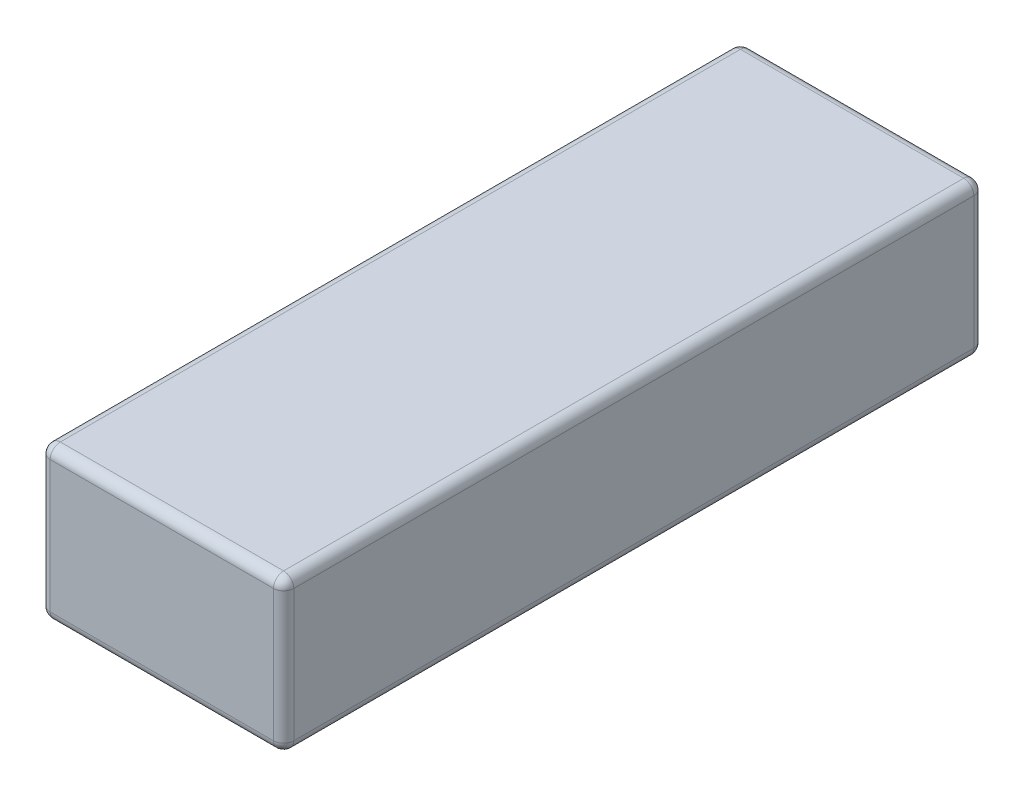
ISO-10303-21;
HEADER;
FILE_DESCRIPTION(('STEP AP214'),'2;1');
FILE_NAME('part.step','',(''),(''),'','','');
FILE_SCHEMA(('AUTOMOTIVE_DESIGN { 1 0 10303 214 1 1 1 1 }'));
ENDSEC;
DATA;
#1=APPLICATION_CONTEXT('core data for automotive mechanical design processes');
#2=APPLICATION_PROTOCOL_DEFINITION('international standard','automotive_design',2000,#1);
#3=PRODUCT_CONTEXT('',#1,'mechanical');
#4=PRODUCT('Part','Part','',(#3));
#5=PRODUCT_RELATED_PRODUCT_CATEGORY('part','',(#4));
#6=PRODUCT_DEFINITION_FORMATION('','',#4);
#7=PRODUCT_DEFINITION_CONTEXT('part definition',#1,'design');
#8=PRODUCT_DEFINITION('design','',#6,#7);
#9=PRODUCT_DEFINITION_SHAPE('','',#8);
#10=(LENGTH_UNIT() NAMED_UNIT(*) SI_UNIT(.MILLI.,.METRE.));
#11=(NAMED_UNIT(*) PLANE_ANGLE_UNIT() SI_UNIT($,.RADIAN.));
#12=(NAMED_UNIT(*) SI_UNIT($,.STERADIAN.) SOLID_ANGLE_UNIT());
#13=UNCERTAINTY_MEASURE_WITH_UNIT(LENGTH_MEASURE(1.E-05),#10,'distance_accuracy_value','');
#14=(GEOMETRIC_REPRESENTATION_CONTEXT(3) GLOBAL_UNCERTAINTY_ASSIGNED_CONTEXT((#13)) GLOBAL_UNIT_ASSIGNED_CONTEXT((#10,
#11,#12)) REPRESENTATION_CONTEXT('',''));
#15=CARTESIAN_POINT('',(0.,0.,0.));
#16=DIRECTION('',(0.,0.,1.));
#17=DIRECTION('',(1.,0.,0.));
#18=AXIS2_PLACEMENT_3D('',#15,#16,#17);
#19=CARTESIAN_POINT('',(48.,30.,-138.));
#20=DIRECTION('',(0.,1.,0.));
#21=DIRECTION('',(-1.,0.,0.));
#22=AXIS2_PLACEMENT_3D('',#19,#20,#21);
#23=PLANE('',#22);
#24=DIRECTION('',(-1.,0.,0.));
#25=VECTOR('',#24,1.);
#26=CARTESIAN_POINT('',(0.,30.,-136.));
#27=LINE('',#26,#25);
#28=CARTESIAN_POINT('',(46.,30.,-136.));
#29=VERTEX_POINT('',#28);
#30=CARTESIAN_POINT('',(2.,30.,-136.));
#31=VERTEX_POINT('',#30);
#32=EDGE_CURVE('E154',#29,#31,#27,.T.);
#33=ORIENTED_EDGE('',*,*,#32,.T.);
#34=DIRECTION('',(0.,0.,1.));
#35=VECTOR('',#34,1.);
#36=CARTESIAN_POINT('',(2.,30.,-138.));
#37=LINE('',#36,#35);
#38=CARTESIAN_POINT('',(2.,30.,-2.));
#39=VERTEX_POINT('',#38);
#40=EDGE_CURVE('E127',#31,#39,#37,.T.);
#41=ORIENTED_EDGE('',*,*,#40,.T.);
#42=DIRECTION('',(-1.,0.,0.));
#43=VECTOR('',#42,1.);
#44=CARTESIAN_POINT('',(48.,30.,-2.));
#45=LINE('',#44,#43);
#46=CARTESIAN_POINT('',(46.,30.,-2.));
#47=VERTEX_POINT('',#46);
#48=EDGE_CURVE('E145',#39,#47,#45,.F.);
#49=ORIENTED_EDGE('',*,*,#48,.T.);
#50=DIRECTION('',(0.,0.,1.));
#51=VECTOR('',#50,1.);
#52=CARTESIAN_POINT('',(46.,30.,-138.));
#53=LINE('',#52,#51);
#54=EDGE_CURVE('E151',#47,#29,#53,.F.);
#55=ORIENTED_EDGE('',*,*,#54,.T.);
#56=EDGE_LOOP('',(#33,#41,#49,#55));
#57=FACE_BOUND('',#56,.T.);
#58=ADVANCED_FACE('F34',(#57),#23,.T.);
#59=CARTESIAN_POINT('',(48.,0.,-138.));
#60=DIRECTION('',(1.,0.,0.));
#61=DIRECTION('',(0.,1.,0.));
#62=AXIS2_PLACEMENT_3D('',#59,#60,#61);
#63=PLANE('',#62);
#64=DIRECTION('',(0.,1.,0.));
#65=VECTOR('',#64,1.);
#66=CARTESIAN_POINT('',(48.,30.,-136.));
#67=LINE('',#66,#65);
#68=CARTESIAN_POINT('',(48.,2.,-136.));
#69=VERTEX_POINT('',#68);
#70=CARTESIAN_POINT('',(48.,28.,-136.));
#71=VERTEX_POINT('',#70);
#72=EDGE_CURVE('E178',#69,#71,#67,.T.);
#73=ORIENTED_EDGE('',*,*,#72,.T.);
#74=DIRECTION('',(0.,0.,1.));
#75=VECTOR('',#74,1.);
#76=CARTESIAN_POINT('',(48.,28.,-138.));
#77=LINE('',#76,#75);
#78=CARTESIAN_POINT('',(48.,28.,-2.));
#79=VERTEX_POINT('',#78);
#80=EDGE_CURVE('E182',#71,#79,#77,.T.);
#81=ORIENTED_EDGE('',*,*,#80,.T.);
#82=DIRECTION('',(0.,1.,0.));
#83=VECTOR('',#82,1.);
#84=CARTESIAN_POINT('',(48.,0.,-2.));
#85=LINE('',#84,#83);
#86=CARTESIAN_POINT('',(48.,2.,-2.));
#87=VERTEX_POINT('',#86);
#88=EDGE_CURVE('E180',#79,#87,#85,.F.);
#89=ORIENTED_EDGE('',*,*,#88,.T.);
#90=DIRECTION('',(0.,0.,1.));
#91=VECTOR('',#90,1.);
#92=CARTESIAN_POINT('',(48.,2.,-138.));
#93=LINE('',#92,#91);
#94=EDGE_CURVE('E176',#87,#69,#93,.F.);
#95=ORIENTED_EDGE('',*,*,#94,.T.);
#96=EDGE_LOOP('',(#73,#81,#89,#95));
#97=FACE_BOUND('',#96,.T.);
#98=ADVANCED_FACE('F298',(#97),#63,.T.);
#99=CARTESIAN_POINT('',(0.,0.,-138.));
#100=DIRECTION('',(0.,-1.,0.));
#101=DIRECTION('',(0.,0.,-1.));
#102=AXIS2_PLACEMENT_3D('',#99,#100,#101);
#103=PLANE('',#102);
#104=DIRECTION('',(1.,0.,0.));
#105=VECTOR('',#104,1.);
#106=CARTESIAN_POINT('',(0.,0.,-2.));
#107=LINE('',#106,#105);
#108=CARTESIAN_POINT('',(46.,0.,-2.));
#109=VERTEX_POINT('',#108);
#110=CARTESIAN_POINT('',(2.,0.,-2.));
#111=VERTEX_POINT('',#110);
#112=EDGE_CURVE('E54',#109,#111,#107,.F.);
#113=ORIENTED_EDGE('',*,*,#112,.T.);
#114=DIRECTION('',(0.,0.,1.));
#115=VECTOR('',#114,1.);
#116=CARTESIAN_POINT('',(2.,0.,-138.));
#117=LINE('',#116,#115);
#118=CARTESIAN_POINT('',(2.,0.,-136.));
#119=VERTEX_POINT('',#118);
#120=EDGE_CURVE('E11',#111,#119,#117,.F.);
#121=ORIENTED_EDGE('',*,*,#120,.T.);
#122=DIRECTION('',(1.,0.,0.));
#123=VECTOR('',#122,1.);
#124=CARTESIAN_POINT('',(48.,0.,-136.));
#125=LINE('',#124,#123);
#126=CARTESIAN_POINT('',(46.,0.,-136.));
#127=VERTEX_POINT('',#126);
#128=EDGE_CURVE('E43',#119,#127,#125,.T.);
#129=ORIENTED_EDGE('',*,*,#128,.T.);
#130=DIRECTION('',(0.,0.,1.));
#131=VECTOR('',#130,1.);
#132=CARTESIAN_POINT('',(46.,0.,-138.));
#133=LINE('',#132,#131);
#134=EDGE_CURVE('E194',#127,#109,#133,.T.);
#135=ORIENTED_EDGE('',*,*,#134,.T.);
#136=EDGE_LOOP('',(#113,#121,#129,#135));
#137=FACE_BOUND('',#136,.T.);
#138=ADVANCED_FACE('F264',(#137),#103,.T.);
#139=CARTESIAN_POINT('',(0.,30.,-138.));
#140=DIRECTION('',(-1.,0.,0.));
#141=DIRECTION('',(0.,0.,1.));
#142=AXIS2_PLACEMENT_3D('',#139,#140,#141);
#143=PLANE('',#142);
#144=DIRECTION('',(0.,-1.,0.));
#145=VECTOR('',#144,1.);
#146=CARTESIAN_POINT('',(0.,30.,-2.));
#147=LINE('',#146,#145);
#148=CARTESIAN_POINT('',(0.,2.,-2.));
#149=VERTEX_POINT('',#148);
#150=CARTESIAN_POINT('',(0.,28.,-2.));
#151=VERTEX_POINT('',#150);
#152=EDGE_CURVE('E158',#149,#151,#147,.F.);
#153=ORIENTED_EDGE('',*,*,#152,.T.);
#154=DIRECTION('',(0.,0.,1.));
#155=VECTOR('',#154,1.);
#156=CARTESIAN_POINT('',(0.,28.,-138.));
#157=LINE('',#156,#155);
#158=CARTESIAN_POINT('',(0.,28.,-136.));
#159=VERTEX_POINT('',#158);
#160=EDGE_CURVE('E129',#151,#159,#157,.F.);
#161=ORIENTED_EDGE('',*,*,#160,.T.);
#162=DIRECTION('',(0.,-1.,0.));
#163=VECTOR('',#162,1.);
#164=CARTESIAN_POINT('',(0.,0.,-136.));
#165=LINE('',#164,#163);
#166=CARTESIAN_POINT('',(0.,2.,-136.));
#167=VERTEX_POINT('',#166);
#168=EDGE_CURVE('E164',#159,#167,#165,.T.);
#169=ORIENTED_EDGE('',*,*,#168,.T.);
#170=DIRECTION('',(0.,0.,1.));
#171=VECTOR('',#170,1.);
#172=CARTESIAN_POINT('',(0.,2.,-138.));
#173=LINE('',#172,#171);
#174=EDGE_CURVE('E156',#167,#149,#173,.T.);
#175=ORIENTED_EDGE('',*,*,#174,.T.);
#176=EDGE_LOOP('',(#153,#161,#169,#175));
#177=FACE_BOUND('',#176,.T.);
#178=ADVANCED_FACE('F319',(#177),#143,.T.);
#179=CARTESIAN_POINT('',(0.,0.,-138.));
#180=DIRECTION('',(0.,0.,1.));
#181=DIRECTION('',(1.,0.,0.));
#182=AXIS2_PLACEMENT_3D('',#179,#180,#181);
#183=PLANE('',#182);
#184=DIRECTION('',(0.,-1.,0.));
#185=VECTOR('',#184,1.);
#186=CARTESIAN_POINT('',(2.,30.,-138.));
#187=LINE('',#186,#185);
#188=CARTESIAN_POINT('',(2.,2.,-138.));
#189=VERTEX_POINT('',#188);
#190=CARTESIAN_POINT('',(2.,28.,-138.));
#191=VERTEX_POINT('',#190);
#192=EDGE_CURVE('E171',#189,#191,#187,.F.);
#193=ORIENTED_EDGE('',*,*,#192,.T.);
#194=DIRECTION('',(-1.,0.,0.));
#195=VECTOR('',#194,1.);
#196=CARTESIAN_POINT('',(48.,28.,-138.));
#197=LINE('',#196,#195);
#198=CARTESIAN_POINT('',(46.,28.,-138.));
#199=VERTEX_POINT('',#198);
#200=EDGE_CURVE('E173',#191,#199,#197,.F.);
#201=ORIENTED_EDGE('',*,*,#200,.T.);
#202=DIRECTION('',(0.,1.,0.));
#203=VECTOR('',#202,1.);
#204=CARTESIAN_POINT('',(46.,0.,-138.));
#205=LINE('',#204,#203);
#206=CARTESIAN_POINT('',(46.,2.,-138.));
#207=VERTEX_POINT('',#206);
#208=EDGE_CURVE('E169',#199,#207,#205,.F.);
#209=ORIENTED_EDGE('',*,*,#208,.T.);
#210=DIRECTION('',(1.,0.,0.));
#211=VECTOR('',#210,1.);
#212=CARTESIAN_POINT('',(0.,2.,-138.));
#213=LINE('',#212,#211);
#214=EDGE_CURVE('E167',#207,#189,#213,.F.);
#215=ORIENTED_EDGE('',*,*,#214,.T.);
#216=EDGE_LOOP('',(#193,#201,#209,#215));
#217=FACE_BOUND('',#216,.T.);
#218=ADVANCED_FACE('F284',(#217),#183,.F.);
#219=CARTESIAN_POINT('',(0.,0.,0.));
#220=DIRECTION('',(0.,0.,1.));
#221=DIRECTION('',(1.,0.,0.));
#222=AXIS2_PLACEMENT_3D('',#219,#220,#221);
#223=PLANE('',#222);
#224=DIRECTION('',(0.,1.,0.));
#225=VECTOR('',#224,1.);
#226=CARTESIAN_POINT('',(46.,0.,0.));
#227=LINE('',#226,#225);
#228=CARTESIAN_POINT('',(46.,2.,0.));
#229=VERTEX_POINT('',#228);
#230=CARTESIAN_POINT('',(46.,28.,0.));
#231=VERTEX_POINT('',#230);
#232=EDGE_CURVE('E189',#229,#231,#227,.T.);
#233=ORIENTED_EDGE('',*,*,#232,.T.);
#234=DIRECTION('',(-1.,0.,0.));
#235=VECTOR('',#234,1.);
#236=CARTESIAN_POINT('',(0.,28.,0.));
#237=LINE('',#236,#235);
#238=CARTESIAN_POINT('',(2.,28.,0.));
#239=VERTEX_POINT('',#238);
#240=EDGE_CURVE('E191',#231,#239,#237,.T.);
#241=ORIENTED_EDGE('',*,*,#240,.T.);
#242=DIRECTION('',(0.,-1.,0.));
#243=VECTOR('',#242,1.);
#244=CARTESIAN_POINT('',(2.,0.,0.));
#245=LINE('',#244,#243);
#246=CARTESIAN_POINT('',(2.,2.,0.));
#247=VERTEX_POINT('',#246);
#248=EDGE_CURVE('E187',#239,#247,#245,.T.);
#249=ORIENTED_EDGE('',*,*,#248,.T.);
#250=DIRECTION('',(1.,0.,0.));
#251=VECTOR('',#250,1.);
#252=CARTESIAN_POINT('',(0.,2.,0.));
#253=LINE('',#252,#251);
#254=EDGE_CURVE('E185',#247,#229,#253,.T.);
#255=ORIENTED_EDGE('',*,*,#254,.T.);
#256=EDGE_LOOP('',(#233,#241,#249,#255));
#257=FACE_BOUND('',#256,.T.);
#258=ADVANCED_FACE('F326',(#257),#223,.T.);
#259=CARTESIAN_POINT('',(46.,2.,-138.));
#260=DIRECTION('',(0.,0.,1.));
#261=DIRECTION('',(1.,0.,0.));
#262=AXIS2_PLACEMENT_3D('',#259,#260,#261);
#263=CYLINDRICAL_SURFACE('',#262,2.);
#264=CARTESIAN_POINT('',(46.,2.,-136.));
#265=DIRECTION('',(0.,0.,-1.));
#266=DIRECTION('',(-1.,0.,0.));
#267=AXIS2_PLACEMENT_3D('',#264,#265,#266);
#268=CIRCLE('',#267,2.);
#269=EDGE_CURVE('E38',#69,#127,#268,.T.);
#270=ORIENTED_EDGE('',*,*,#269,.F.);
#271=ORIENTED_EDGE('',*,*,#94,.F.);
#272=CARTESIAN_POINT('',(46.,2.,-2.));
#273=DIRECTION('',(0.,0.,1.));
#274=DIRECTION('',(1.,0.,0.));
#275=AXIS2_PLACEMENT_3D('',#272,#273,#274);
#276=CIRCLE('',#275,2.);
#277=EDGE_CURVE('E247',#109,#87,#276,.T.);
#278=ORIENTED_EDGE('',*,*,#277,.F.);
#279=ORIENTED_EDGE('',*,*,#134,.F.);
#280=EDGE_LOOP('',(#270,#271,#278,#279));
#281=FACE_BOUND('',#280,.T.);
#282=ADVANCED_FACE('F36',(#281),#263,.T.);
#283=CARTESIAN_POINT('',(46.,2.,-136.));
#284=DIRECTION('',(0.,0.,1.));
#285=DIRECTION('',(1.,0.,0.));
#286=AXIS2_PLACEMENT_3D('',#283,#284,#285);
#287=SPHERICAL_SURFACE('',#286,2.);
#288=CARTESIAN_POINT('',(46.,2.,-136.));
#289=DIRECTION('',(0.,-1.,0.));
#290=DIRECTION('',(1.,0.,0.));
#291=AXIS2_PLACEMENT_3D('',#288,#289,#290);
#292=CIRCLE('',#291,2.);
#293=EDGE_CURVE('E243',#69,#207,#292,.F.);
#294=ORIENTED_EDGE('',*,*,#293,.F.);
#295=ORIENTED_EDGE('',*,*,#269,.T.);
#296=CARTESIAN_POINT('',(46.,2.,-136.));
#297=DIRECTION('',(1.,0.,0.));
#298=DIRECTION('',(0.,0.,-1.));
#299=AXIS2_PLACEMENT_3D('',#296,#297,#298);
#300=CIRCLE('',#299,2.);
#301=EDGE_CURVE('E246',#207,#127,#300,.F.);
#302=ORIENTED_EDGE('',*,*,#301,.F.);
#303=EDGE_LOOP('',(#294,#295,#302));
#304=FACE_BOUND('',#303,.T.);
#305=ADVANCED_FACE('F259',(#304),#287,.T.);
#306=CARTESIAN_POINT('',(46.,2.,-2.));
#307=DIRECTION('',(0.,0.,1.));
#308=DIRECTION('',(1.,0.,0.));
#309=AXIS2_PLACEMENT_3D('',#306,#307,#308);
#310=SPHERICAL_SURFACE('',#309,2.);
#311=CARTESIAN_POINT('',(46.,2.,-2.));
#312=DIRECTION('',(1.,0.,0.));
#313=DIRECTION('',(0.,0.,-1.));
#314=AXIS2_PLACEMENT_3D('',#311,#312,#313);
#315=CIRCLE('',#314,2.);
#316=EDGE_CURVE('E237',#109,#229,#315,.F.);
#317=ORIENTED_EDGE('',*,*,#316,.F.);
#318=ORIENTED_EDGE('',*,*,#277,.T.);
#319=CARTESIAN_POINT('',(46.,2.,-2.));
#320=DIRECTION('',(0.,-1.,0.));
#321=DIRECTION('',(1.,0.,0.));
#322=AXIS2_PLACEMENT_3D('',#319,#320,#321);
#323=CIRCLE('',#322,2.);
#324=EDGE_CURVE('E240',#229,#87,#323,.F.);
#325=ORIENTED_EDGE('',*,*,#324,.F.);
#326=EDGE_LOOP('',(#317,#318,#325));
#327=FACE_BOUND('',#326,.T.);
#328=ADVANCED_FACE('F308',(#327),#310,.T.);
#329=CARTESIAN_POINT('',(0.,2.,-136.));
#330=DIRECTION('',(-1.,0.,0.));
#331=DIRECTION('',(0.,0.,1.));
#332=AXIS2_PLACEMENT_3D('',#329,#330,#331);
#333=CYLINDRICAL_SURFACE('',#332,2.);
#334=ORIENTED_EDGE('',*,*,#301,.T.);
#335=ORIENTED_EDGE('',*,*,#128,.F.);
#336=CARTESIAN_POINT('',(2.,2.,-136.));
#337=DIRECTION('',(-1.,0.,0.));
#338=DIRECTION('',(0.,0.,1.));
#339=AXIS2_PLACEMENT_3D('',#336,#337,#338);
#340=CIRCLE('',#339,2.);
#341=EDGE_CURVE('E231',#189,#119,#340,.T.);
#342=ORIENTED_EDGE('',*,*,#341,.F.);
#343=ORIENTED_EDGE('',*,*,#214,.F.);
#344=EDGE_LOOP('',(#334,#335,#342,#343));
#345=FACE_BOUND('',#344,.T.);
#346=ADVANCED_FACE('F268',(#345),#333,.T.);
#347=CARTESIAN_POINT('',(46.,0.,-136.));
#348=DIRECTION('',(0.,-1.,0.));
#349=DIRECTION('',(1.,0.,0.));
#350=AXIS2_PLACEMENT_3D('',#347,#348,#349);
#351=CYLINDRICAL_SURFACE('',#350,2.);
#352=ORIENTED_EDGE('',*,*,#293,.T.);
#353=ORIENTED_EDGE('',*,*,#208,.F.);
#354=CARTESIAN_POINT('',(46.,28.,-136.));
#355=DIRECTION('',(0.,1.,0.));
#356=DIRECTION('',(0.,0.,1.));
#357=AXIS2_PLACEMENT_3D('',#354,#355,#356);
#358=CIRCLE('',#357,2.);
#359=EDGE_CURVE('E228',#71,#199,#358,.T.);
#360=ORIENTED_EDGE('',*,*,#359,.F.);
#361=ORIENTED_EDGE('',*,*,#72,.F.);
#362=EDGE_LOOP('',(#352,#353,#360,#361));
#363=FACE_BOUND('',#362,.T.);
#364=ADVANCED_FACE('F295',(#363),#351,.T.);
#365=CARTESIAN_POINT('',(46.,28.,-138.));
#366=DIRECTION('',(0.,0.,1.));
#367=DIRECTION('',(1.,0.,0.));
#368=AXIS2_PLACEMENT_3D('',#365,#366,#367);
#369=CYLINDRICAL_SURFACE('',#368,2.);
#370=CARTESIAN_POINT('',(46.,28.,-2.));
#371=DIRECTION('',(0.,0.,1.));
#372=DIRECTION('',(1.,0.,0.));
#373=AXIS2_PLACEMENT_3D('',#370,#371,#372);
#374=CIRCLE('',#373,2.);
#375=EDGE_CURVE('E222',#79,#47,#374,.T.);
#376=ORIENTED_EDGE('',*,*,#375,.F.);
#377=ORIENTED_EDGE('',*,*,#80,.F.);
#378=CARTESIAN_POINT('',(46.,28.,-136.));
#379=DIRECTION('',(0.,0.,-1.));
#380=DIRECTION('',(-1.,0.,0.));
#381=AXIS2_PLACEMENT_3D('',#378,#379,#380);
#382=CIRCLE('',#381,2.);
#383=EDGE_CURVE('E225',#29,#71,#382,.T.);
#384=ORIENTED_EDGE('',*,*,#383,.F.);
#385=ORIENTED_EDGE('',*,*,#54,.F.);
#386=EDGE_LOOP('',(#376,#377,#384,#385));
#387=FACE_BOUND('',#386,.T.);
#388=ADVANCED_FACE('F301',(#387),#369,.T.);
#389=CARTESIAN_POINT('',(46.,0.,-2.));
#390=DIRECTION('',(0.,1.,0.));
#391=DIRECTION('',(-1.,0.,0.));
#392=AXIS2_PLACEMENT_3D('',#389,#390,#391);
#393=CYLINDRICAL_SURFACE('',#392,2.);
#394=ORIENTED_EDGE('',*,*,#324,.T.);
#395=ORIENTED_EDGE('',*,*,#88,.F.);
#396=CARTESIAN_POINT('',(46.,28.,-2.));
#397=DIRECTION('',(0.,1.,0.));
#398=DIRECTION('',(0.,0.,1.));
#399=AXIS2_PLACEMENT_3D('',#396,#397,#398);
#400=CIRCLE('',#399,2.);
#401=EDGE_CURVE('E220',#231,#79,#400,.T.);
#402=ORIENTED_EDGE('',*,*,#401,.F.);
#403=ORIENTED_EDGE('',*,*,#232,.F.);
#404=EDGE_LOOP('',(#394,#395,#402,#403));
#405=FACE_BOUND('',#404,.T.);
#406=ADVANCED_FACE('F306',(#405),#393,.T.);
#407=CARTESIAN_POINT('',(0.,2.,-2.));
#408=DIRECTION('',(1.,0.,0.));
#409=DIRECTION('',(0.,0.,-1.));
#410=AXIS2_PLACEMENT_3D('',#407,#408,#409);
#411=CYLINDRICAL_SURFACE('',#410,2.);
#412=ORIENTED_EDGE('',*,*,#316,.T.);
#413=ORIENTED_EDGE('',*,*,#254,.F.);
#414=CARTESIAN_POINT('',(2.,2.,-2.));
#415=DIRECTION('',(-1.,0.,0.));
#416=DIRECTION('',(0.,0.,1.));
#417=AXIS2_PLACEMENT_3D('',#414,#415,#416);
#418=CIRCLE('',#417,2.);
#419=EDGE_CURVE('E217',#111,#247,#418,.T.);
#420=ORIENTED_EDGE('',*,*,#419,.F.);
#421=ORIENTED_EDGE('',*,*,#112,.F.);
#422=EDGE_LOOP('',(#412,#413,#420,#421));
#423=FACE_BOUND('',#422,.T.);
#424=ADVANCED_FACE('F311',(#423),#411,.T.);
#425=CARTESIAN_POINT('',(2.,2.,-138.));
#426=DIRECTION('',(0.,0.,1.));
#427=DIRECTION('',(1.,0.,0.));
#428=AXIS2_PLACEMENT_3D('',#425,#426,#427);
#429=CYLINDRICAL_SURFACE('',#428,2.);
#430=CARTESIAN_POINT('',(2.,2.,-136.));
#431=DIRECTION('',(0.,0.,-1.));
#432=DIRECTION('',(-1.,0.,0.));
#433=AXIS2_PLACEMENT_3D('',#430,#431,#432);
#434=CIRCLE('',#433,2.);
#435=EDGE_CURVE('E234',#119,#167,#434,.T.);
#436=ORIENTED_EDGE('',*,*,#435,.F.);
#437=ORIENTED_EDGE('',*,*,#120,.F.);
#438=CARTESIAN_POINT('',(2.,2.,-2.));
#439=DIRECTION('',(0.,0.,1.));
#440=DIRECTION('',(1.,0.,0.));
#441=AXIS2_PLACEMENT_3D('',#438,#439,#440);
#442=CIRCLE('',#441,2.);
#443=EDGE_CURVE('E214',#149,#111,#442,.T.);
#444=ORIENTED_EDGE('',*,*,#443,.F.);
#445=ORIENTED_EDGE('',*,*,#174,.F.);
#446=EDGE_LOOP('',(#436,#437,#444,#445));
#447=FACE_BOUND('',#446,.T.);
#448=ADVANCED_FACE('F272',(#447),#429,.T.);
#449=CARTESIAN_POINT('',(2.,2.,-136.));
#450=DIRECTION('',(0.,0.,1.));
#451=DIRECTION('',(1.,0.,0.));
#452=AXIS2_PLACEMENT_3D('',#449,#450,#451);
#453=SPHERICAL_SURFACE('',#452,2.);
#454=ORIENTED_EDGE('',*,*,#341,.T.);
#455=ORIENTED_EDGE('',*,*,#435,.T.);
#456=CARTESIAN_POINT('',(2.,2.,-136.));
#457=DIRECTION('',(0.,-1.,0.));
#458=DIRECTION('',(0.,0.,-1.));
#459=AXIS2_PLACEMENT_3D('',#456,#457,#458);
#460=CIRCLE('',#459,2.);
#461=EDGE_CURVE('E211',#189,#167,#460,.F.);
#462=ORIENTED_EDGE('',*,*,#461,.F.);
#463=EDGE_LOOP('',(#454,#455,#462));
#464=FACE_BOUND('',#463,.T.);
#465=ADVANCED_FACE('F276',(#464),#453,.T.);
#466=CARTESIAN_POINT('',(46.,28.,-136.));
#467=DIRECTION('',(0.,0.,1.));
#468=DIRECTION('',(1.,0.,0.));
#469=AXIS2_PLACEMENT_3D('',#466,#467,#468);
#470=SPHERICAL_SURFACE('',#469,2.);
#471=ORIENTED_EDGE('',*,*,#383,.T.);
#472=ORIENTED_EDGE('',*,*,#359,.T.);
#473=CARTESIAN_POINT('',(46.,28.,-136.));
#474=DIRECTION('',(1.,0.,0.));
#475=DIRECTION('',(0.,0.,-1.));
#476=AXIS2_PLACEMENT_3D('',#473,#474,#475);
#477=CIRCLE('',#476,2.);
#478=EDGE_CURVE('E209',#29,#199,#477,.F.);
#479=ORIENTED_EDGE('',*,*,#478,.F.);
#480=EDGE_LOOP('',(#471,#472,#479));
#481=FACE_BOUND('',#480,.T.);
#482=ADVANCED_FACE('F292',(#481),#470,.T.);
#483=CARTESIAN_POINT('',(46.,28.,-2.));
#484=DIRECTION('',(0.,0.,1.));
#485=DIRECTION('',(1.,0.,0.));
#486=AXIS2_PLACEMENT_3D('',#483,#484,#485);
#487=SPHERICAL_SURFACE('',#486,2.);
#488=ORIENTED_EDGE('',*,*,#401,.T.);
#489=ORIENTED_EDGE('',*,*,#375,.T.);
#490=CARTESIAN_POINT('',(46.,28.,-2.));
#491=DIRECTION('',(1.,0.,0.));
#492=DIRECTION('',(0.,0.,-1.));
#493=AXIS2_PLACEMENT_3D('',#490,#491,#492);
#494=CIRCLE('',#493,2.);
#495=EDGE_CURVE('E148',#231,#47,#494,.F.);
#496=ORIENTED_EDGE('',*,*,#495,.F.);
#497=EDGE_LOOP('',(#488,#489,#496));
#498=FACE_BOUND('',#497,.T.);
#499=ADVANCED_FACE('F354',(#498),#487,.T.);
#500=CARTESIAN_POINT('',(2.,2.,-2.));
#501=DIRECTION('',(0.,0.,1.));
#502=DIRECTION('',(1.,0.,0.));
#503=AXIS2_PLACEMENT_3D('',#500,#501,#502);
#504=SPHERICAL_SURFACE('',#503,2.);
#505=ORIENTED_EDGE('',*,*,#443,.T.);
#506=ORIENTED_EDGE('',*,*,#419,.T.);
#507=CARTESIAN_POINT('',(2.,2.,-2.));
#508=DIRECTION('',(0.,-1.,0.));
#509=DIRECTION('',(1.,0.,0.));
#510=AXIS2_PLACEMENT_3D('',#507,#508,#509);
#511=CIRCLE('',#510,2.);
#512=EDGE_CURVE('E205',#149,#247,#511,.F.);
#513=ORIENTED_EDGE('',*,*,#512,.F.);
#514=EDGE_LOOP('',(#505,#506,#513));
#515=FACE_BOUND('',#514,.T.);
#516=ADVANCED_FACE('F314',(#515),#504,.T.);
#517=CARTESIAN_POINT('',(2.,30.,-136.));
#518=DIRECTION('',(0.,1.,0.));
#519=DIRECTION('',(0.,0.,1.));
#520=AXIS2_PLACEMENT_3D('',#517,#518,#519);
#521=CYLINDRICAL_SURFACE('',#520,2.);
#522=ORIENTED_EDGE('',*,*,#461,.T.);
#523=ORIENTED_EDGE('',*,*,#168,.F.);
#524=CARTESIAN_POINT('',(2.,28.,-136.));
#525=DIRECTION('',(0.,1.,0.));
#526=DIRECTION('',(0.,0.,1.));
#527=AXIS2_PLACEMENT_3D('',#524,#525,#526);
#528=CIRCLE('',#527,2.);
#529=EDGE_CURVE('E202',#191,#159,#528,.T.);
#530=ORIENTED_EDGE('',*,*,#529,.F.);
#531=ORIENTED_EDGE('',*,*,#192,.F.);
#532=EDGE_LOOP('',(#522,#523,#530,#531));
#533=FACE_BOUND('',#532,.T.);
#534=ADVANCED_FACE('F281',(#533),#521,.T.);
#535=CARTESIAN_POINT('',(48.,28.,-136.));
#536=DIRECTION('',(1.,0.,0.));
#537=DIRECTION('',(0.,1.,0.));
#538=AXIS2_PLACEMENT_3D('',#535,#536,#537);
#539=CYLINDRICAL_SURFACE('',#538,2.);
#540=ORIENTED_EDGE('',*,*,#478,.T.);
#541=ORIENTED_EDGE('',*,*,#200,.F.);
#542=CARTESIAN_POINT('',(2.,28.,-136.));
#543=DIRECTION('',(-1.,0.,0.));
#544=DIRECTION('',(0.,0.,1.));
#545=AXIS2_PLACEMENT_3D('',#542,#543,#544);
#546=CIRCLE('',#545,2.);
#547=EDGE_CURVE('E142',#31,#191,#546,.T.);
#548=ORIENTED_EDGE('',*,*,#547,.F.);
#549=ORIENTED_EDGE('',*,*,#32,.F.);
#550=EDGE_LOOP('',(#540,#541,#548,#549));
#551=FACE_BOUND('',#550,.T.);
#552=ADVANCED_FACE('F286',(#551),#539,.T.);
#553=CARTESIAN_POINT('',(0.,28.,-2.));
#554=DIRECTION('',(-1.,0.,0.));
#555=DIRECTION('',(0.,-1.,0.));
#556=AXIS2_PLACEMENT_3D('',#553,#554,#555);
#557=CYLINDRICAL_SURFACE('',#556,2.);
#558=ORIENTED_EDGE('',*,*,#495,.T.);
#559=ORIENTED_EDGE('',*,*,#48,.F.);
#560=CARTESIAN_POINT('',(2.,28.,-2.));
#561=DIRECTION('',(-1.,0.,0.));
#562=DIRECTION('',(0.,-1.,0.));
#563=AXIS2_PLACEMENT_3D('',#560,#561,#562);
#564=CIRCLE('',#563,2.);
#565=EDGE_CURVE('E134',#239,#39,#564,.T.);
#566=ORIENTED_EDGE('',*,*,#565,.F.);
#567=ORIENTED_EDGE('',*,*,#240,.F.);
#568=EDGE_LOOP('',(#558,#559,#566,#567));
#569=FACE_BOUND('',#568,.T.);
#570=ADVANCED_FACE('F146',(#569),#557,.T.);
#571=CARTESIAN_POINT('',(2.,0.,-2.));
#572=DIRECTION('',(0.,-1.,0.));
#573=DIRECTION('',(0.,0.,-1.));
#574=AXIS2_PLACEMENT_3D('',#571,#572,#573);
#575=CYLINDRICAL_SURFACE('',#574,2.);
#576=ORIENTED_EDGE('',*,*,#512,.T.);
#577=ORIENTED_EDGE('',*,*,#248,.F.);
#578=CARTESIAN_POINT('',(2.,28.,-2.));
#579=DIRECTION('',(0.,1.,0.));
#580=DIRECTION('',(0.,0.,1.));
#581=AXIS2_PLACEMENT_3D('',#578,#579,#580);
#582=CIRCLE('',#581,2.);
#583=EDGE_CURVE('E138',#151,#239,#582,.T.);
#584=ORIENTED_EDGE('',*,*,#583,.F.);
#585=ORIENTED_EDGE('',*,*,#152,.F.);
#586=EDGE_LOOP('',(#576,#577,#584,#585));
#587=FACE_BOUND('',#586,.T.);
#588=ADVANCED_FACE('F317',(#587),#575,.T.);
#589=CARTESIAN_POINT('',(2.,28.,-136.));
#590=DIRECTION('',(0.,0.,1.));
#591=DIRECTION('',(1.,0.,0.));
#592=AXIS2_PLACEMENT_3D('',#589,#590,#591);
#593=SPHERICAL_SURFACE('',#592,2.);
#594=ORIENTED_EDGE('',*,*,#547,.T.);
#595=ORIENTED_EDGE('',*,*,#529,.T.);
#596=CARTESIAN_POINT('',(2.,28.,-136.));
#597=DIRECTION('',(0.,0.,-1.));
#598=DIRECTION('',(-1.,0.,0.));
#599=AXIS2_PLACEMENT_3D('',#596,#597,#598);
#600=CIRCLE('',#599,2.);
#601=EDGE_CURVE('E131',#31,#159,#600,.F.);
#602=ORIENTED_EDGE('',*,*,#601,.F.);
#603=EDGE_LOOP('',(#594,#595,#602));
#604=FACE_BOUND('',#603,.T.);
#605=ADVANCED_FACE('F340',(#604),#593,.T.);
#606=CARTESIAN_POINT('',(2.,28.,-2.));
#607=DIRECTION('',(0.,0.,1.));
#608=DIRECTION('',(1.,0.,0.));
#609=AXIS2_PLACEMENT_3D('',#606,#607,#608);
#610=SPHERICAL_SURFACE('',#609,2.);
#611=ORIENTED_EDGE('',*,*,#583,.T.);
#612=ORIENTED_EDGE('',*,*,#565,.T.);
#613=CARTESIAN_POINT('',(2.,28.,-2.));
#614=DIRECTION('',(0.,0.,1.));
#615=DIRECTION('',(1.,0.,0.));
#616=AXIS2_PLACEMENT_3D('',#613,#614,#615);
#617=CIRCLE('',#616,2.);
#618=EDGE_CURVE('E123',#151,#39,#617,.F.);
#619=ORIENTED_EDGE('',*,*,#618,.F.);
#620=EDGE_LOOP('',(#611,#612,#619));
#621=FACE_BOUND('',#620,.T.);
#622=ADVANCED_FACE('F136',(#621),#610,.T.);
#623=CARTESIAN_POINT('',(2.,28.,-138.));
#624=DIRECTION('',(0.,0.,1.));
#625=DIRECTION('',(1.,0.,0.));
#626=AXIS2_PLACEMENT_3D('',#623,#624,#625);
#627=CYLINDRICAL_SURFACE('',#626,2.);
#628=ORIENTED_EDGE('',*,*,#601,.T.);
#629=ORIENTED_EDGE('',*,*,#160,.F.);
#630=ORIENTED_EDGE('',*,*,#618,.T.);
#631=ORIENTED_EDGE('',*,*,#40,.F.);
#632=EDGE_LOOP('',(#628,#629,#630,#631));
#633=FACE_BOUND('',#632,.T.);
#634=ADVANCED_FACE('F125',(#633),#627,.T.);
#635=CLOSED_SHELL('',(#58,#98,#138,#178,#218,#258,#282,#305,#328,#346,#364,#388,#406,#424,#448,
#465,#482,#499,#516,#534,#552,#570,#588,#605,#622,#634));
#636=MANIFOLD_SOLID_BREP('B2',#635);
#637=ADVANCED_BREP_SHAPE_REPRESENTATION('',(#18,#636),#14);
#638=SHAPE_DEFINITION_REPRESENTATION(#9,#637);
ENDSEC;
END-ISO-10303-21;
